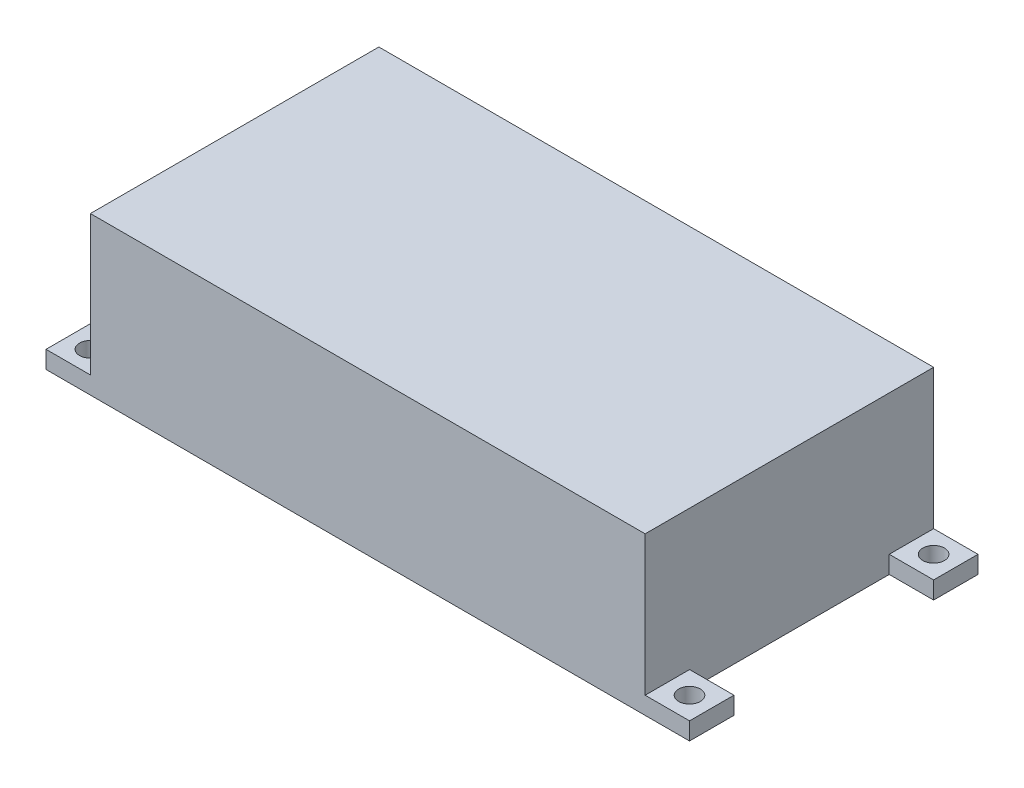
ISO-10303-21;
HEADER;
FILE_DESCRIPTION(('STEP AP214'),'2;1');
FILE_NAME('part.step','',(''),(''),'','','');
FILE_SCHEMA(('AUTOMOTIVE_DESIGN { 1 0 10303 214 1 1 1 1 }'));
ENDSEC;
DATA;
#1=APPLICATION_CONTEXT('core data for automotive mechanical design processes');
#2=APPLICATION_PROTOCOL_DEFINITION('international standard','automotive_design',2000,#1);
#3=PRODUCT_CONTEXT('',#1,'mechanical');
#4=PRODUCT('Part','Part','',(#3));
#5=PRODUCT_RELATED_PRODUCT_CATEGORY('part','',(#4));
#6=PRODUCT_DEFINITION_FORMATION('','',#4);
#7=PRODUCT_DEFINITION_CONTEXT('part definition',#1,'design');
#8=PRODUCT_DEFINITION('design','',#6,#7);
#9=PRODUCT_DEFINITION_SHAPE('','',#8);
#10=(LENGTH_UNIT() NAMED_UNIT(*) SI_UNIT(.MILLI.,.METRE.));
#11=(NAMED_UNIT(*) PLANE_ANGLE_UNIT() SI_UNIT($,.RADIAN.));
#12=(NAMED_UNIT(*) SI_UNIT($,.STERADIAN.) SOLID_ANGLE_UNIT());
#13=UNCERTAINTY_MEASURE_WITH_UNIT(LENGTH_MEASURE(1.E-05),#10,'distance_accuracy_value','');
#14=(GEOMETRIC_REPRESENTATION_CONTEXT(3) GLOBAL_UNCERTAINTY_ASSIGNED_CONTEXT((#13)) GLOBAL_UNIT_ASSIGNED_CONTEXT((#10,
#11,#12)) REPRESENTATION_CONTEXT('',''));
#15=CARTESIAN_POINT('',(0.,0.,0.));
#16=DIRECTION('',(0.,0.,1.));
#17=DIRECTION('',(1.,0.,0.));
#18=AXIS2_PLACEMENT_3D('',#15,#16,#17);
#19=CARTESIAN_POINT('',(6.35000038146973,22.5,41.2749977111816));
#20=DIRECTION('',(1.,0.,0.));
#21=DIRECTION('',(0.,0.,-1.));
#22=AXIS2_PLACEMENT_3D('',#19,#20,#21);
#23=PLANE('',#22);
#24=DIRECTION('',(0.,0.,-1.));
#25=VECTOR('',#24,1.);
#26=CARTESIAN_POINT('',(6.35000038146973,2.5,0.));
#27=LINE('',#26,#25);
#28=CARTESIAN_POINT('',(6.35000038146973,2.5,6.35000038146973));
#29=VERTEX_POINT('',#28);
#30=CARTESIAN_POINT('',(6.35000038146973,2.50000000000001,0.));
#31=VERTEX_POINT('',#30);
#32=EDGE_CURVE('E54',#29,#31,#27,.T.);
#33=ORIENTED_EDGE('',*,*,#32,.F.);
#34=DIRECTION('',(0.,-1.,0.));
#35=VECTOR('',#34,1.);
#36=CARTESIAN_POINT('',(6.35000038146973,2.5,6.35000038146973));
#37=LINE('',#36,#35);
#38=CARTESIAN_POINT('',(6.35000038146973,0.,6.35000038146973));
#39=VERTEX_POINT('',#38);
#40=EDGE_CURVE('E212',#29,#39,#37,.T.);
#41=ORIENTED_EDGE('',*,*,#40,.T.);
#42=DIRECTION('',(0.,0.,1.));
#43=VECTOR('',#42,1.);
#44=CARTESIAN_POINT('',(6.35000038146973,0.,41.2749977111816));
#45=LINE('',#44,#43);
#46=CARTESIAN_POINT('',(6.35000038146973,0.,34.916017758523));
#47=VERTEX_POINT('',#46);
#48=EDGE_CURVE('E371',#39,#47,#45,.T.);
#49=ORIENTED_EDGE('',*,*,#48,.T.);
#50=DIRECTION('',(0.,-1.,0.));
#51=VECTOR('',#50,1.);
#52=CARTESIAN_POINT('',(6.35000038146973,2.5,34.916017758523));
#53=LINE('',#52,#51);
#54=CARTESIAN_POINT('',(6.35000038146973,2.5,34.916017758523));
#55=VERTEX_POINT('',#54);
#56=EDGE_CURVE('E248',#55,#47,#53,.T.);
#57=ORIENTED_EDGE('',*,*,#56,.F.);
#58=DIRECTION('',(0.,0.,-1.));
#59=VECTOR('',#58,1.);
#60=CARTESIAN_POINT('',(6.35000038146973,2.5,41.2749977111816));
#61=LINE('',#60,#59);
#62=CARTESIAN_POINT('',(6.35000038146973,2.50000000000001,41.2749977111816));
#63=VERTEX_POINT('',#62);
#64=EDGE_CURVE('E237',#63,#55,#61,.T.);
#65=ORIENTED_EDGE('',*,*,#64,.F.);
#66=DIRECTION('',(0.,-1.,0.));
#67=VECTOR('',#66,1.);
#68=CARTESIAN_POINT('',(6.35000038146973,22.5,41.2749977111816));
#69=LINE('',#68,#67);
#70=CARTESIAN_POINT('',(6.35000038146973,22.5,41.2749977111816));
#71=VERTEX_POINT('',#70);
#72=EDGE_CURVE('E375',#71,#63,#69,.T.);
#73=ORIENTED_EDGE('',*,*,#72,.F.);
#74=DIRECTION('',(0.,0.,1.));
#75=VECTOR('',#74,1.);
#76=CARTESIAN_POINT('',(6.35000038146973,22.5,41.2749977111816));
#77=LINE('',#76,#75);
#78=CARTESIAN_POINT('',(6.35000038146973,22.5,0.));
#79=VERTEX_POINT('',#78);
#80=EDGE_CURVE('E362',#79,#71,#77,.T.);
#81=ORIENTED_EDGE('',*,*,#80,.F.);
#82=DIRECTION('',(0.,-1.,0.));
#83=VECTOR('',#82,1.);
#84=CARTESIAN_POINT('',(6.35000038146973,22.5,0.));
#85=LINE('',#84,#83);
#86=EDGE_CURVE('E47',#79,#31,#85,.T.);
#87=ORIENTED_EDGE('',*,*,#86,.T.);
#88=EDGE_LOOP('',(#33,#41,#49,#57,#65,#73,#81,#87));
#89=FACE_BOUND('',#88,.T.);
#90=ADVANCED_FACE('F39',(#89),#23,.F.);
#91=CARTESIAN_POINT('',(85.7250061035156,22.5,41.2749977111816));
#92=DIRECTION('',(-1.,0.,0.));
#93=DIRECTION('',(0.,0.,1.));
#94=AXIS2_PLACEMENT_3D('',#91,#92,#93);
#95=PLANE('',#94);
#96=DIRECTION('',(0.,0.,1.));
#97=VECTOR('',#96,1.);
#98=CARTESIAN_POINT('',(85.7250061035156,2.5,41.2749977111816));
#99=LINE('',#98,#97);
#100=CARTESIAN_POINT('',(85.7250061035156,2.5,34.916017758523));
#101=VERTEX_POINT('',#100);
#102=CARTESIAN_POINT('',(85.7250061035156,2.50000000000001,41.2749977111816));
#103=VERTEX_POINT('',#102);
#104=EDGE_CURVE('E261',#101,#103,#99,.T.);
#105=ORIENTED_EDGE('',*,*,#104,.F.);
#106=DIRECTION('',(0.,-1.,0.));
#107=VECTOR('',#106,1.);
#108=CARTESIAN_POINT('',(85.7250061035156,2.5,34.916017758523));
#109=LINE('',#108,#107);
#110=CARTESIAN_POINT('',(85.7250061035156,0.,34.916017758523));
#111=VERTEX_POINT('',#110);
#112=EDGE_CURVE('E272',#101,#111,#109,.T.);
#113=ORIENTED_EDGE('',*,*,#112,.T.);
#114=DIRECTION('',(0.,0.,-1.));
#115=VECTOR('',#114,1.);
#116=CARTESIAN_POINT('',(85.7250061035156,0.,41.2749977111816));
#117=LINE('',#116,#115);
#118=CARTESIAN_POINT('',(85.7250061035156,0.,6.34999942779541));
#119=VERTEX_POINT('',#118);
#120=EDGE_CURVE('E351',#111,#119,#117,.T.);
#121=ORIENTED_EDGE('',*,*,#120,.T.);
#122=DIRECTION('',(0.,-1.,0.));
#123=VECTOR('',#122,1.);
#124=CARTESIAN_POINT('',(85.7250061035156,2.5,6.34999942779541));
#125=LINE('',#124,#123);
#126=CARTESIAN_POINT('',(85.7250061035156,2.5,6.34999942779541));
#127=VERTEX_POINT('',#126);
#128=EDGE_CURVE('E311',#127,#119,#125,.T.);
#129=ORIENTED_EDGE('',*,*,#128,.F.);
#130=DIRECTION('',(0.,0.,1.));
#131=VECTOR('',#130,1.);
#132=CARTESIAN_POINT('',(85.7250061035156,2.5,0.));
#133=LINE('',#132,#131);
#134=CARTESIAN_POINT('',(85.7250061035156,2.50000000000001,0.));
#135=VERTEX_POINT('',#134);
#136=EDGE_CURVE('E291',#135,#127,#133,.T.);
#137=ORIENTED_EDGE('',*,*,#136,.F.);
#138=DIRECTION('',(0.,-1.,0.));
#139=VECTOR('',#138,1.);
#140=CARTESIAN_POINT('',(85.7250061035156,22.5,0.));
#141=LINE('',#140,#139);
#142=CARTESIAN_POINT('',(85.7250061035156,22.5,0.));
#143=VERTEX_POINT('',#142);
#144=EDGE_CURVE('E11',#143,#135,#141,.T.);
#145=ORIENTED_EDGE('',*,*,#144,.F.);
#146=DIRECTION('',(0.,0.,-1.));
#147=VECTOR('',#146,1.);
#148=CARTESIAN_POINT('',(85.7250061035156,22.5,41.2749977111816));
#149=LINE('',#148,#147);
#150=CARTESIAN_POINT('',(85.7250061035156,22.5,41.2749977111816));
#151=VERTEX_POINT('',#150);
#152=EDGE_CURVE('E356',#151,#143,#149,.T.);
#153=ORIENTED_EDGE('',*,*,#152,.F.);
#154=DIRECTION('',(0.,-1.,0.));
#155=VECTOR('',#154,1.);
#156=CARTESIAN_POINT('',(85.7250061035156,22.5,41.2749977111816));
#157=LINE('',#156,#155);
#158=EDGE_CURVE('E366',#151,#103,#157,.T.);
#159=ORIENTED_EDGE('',*,*,#158,.T.);
#160=EDGE_LOOP('',(#105,#113,#121,#129,#137,#145,#153,#159));
#161=FACE_BOUND('',#160,.T.);
#162=ADVANCED_FACE('F41',(#161),#95,.F.);
#163=CARTESIAN_POINT('',(85.7250061035156,22.5,0.));
#164=DIRECTION('',(0.,0.,1.));
#165=DIRECTION('',(1.,0.,0.));
#166=AXIS2_PLACEMENT_3D('',#163,#164,#165);
#167=PLANE('',#166);
#168=DIRECTION('',(1.,0.,0.));
#169=VECTOR('',#168,1.);
#170=CARTESIAN_POINT('',(7.93750047683716,21.,0.));
#171=LINE('',#170,#169);
#172=CARTESIAN_POINT('',(7.93750047683716,21.,0.));
#173=VERTEX_POINT('',#172);
#174=CARTESIAN_POINT('',(15.2375004768372,21.,0.));
#175=VERTEX_POINT('',#174);
#176=EDGE_CURVE('E315',#173,#175,#171,.T.);
#177=ORIENTED_EDGE('',*,*,#176,.F.);
#178=DIRECTION('',(0.,-1.,0.));
#179=VECTOR('',#178,1.);
#180=CARTESIAN_POINT('',(7.93750047683716,21.,0.));
#181=LINE('',#180,#179);
#182=CARTESIAN_POINT('',(7.93750047683716,0.,0.));
#183=VERTEX_POINT('',#182);
#184=EDGE_CURVE('E320',#173,#183,#181,.T.);
#185=ORIENTED_EDGE('',*,*,#184,.T.);
#186=DIRECTION('',(-1.,0.,0.));
#187=VECTOR('',#186,1.);
#188=CARTESIAN_POINT('',(85.7250061035156,0.,0.));
#189=LINE('',#188,#187);
#190=CARTESIAN_POINT('',(0.,0.,0.));
#191=VERTEX_POINT('',#190);
#192=EDGE_CURVE('E201',#183,#191,#189,.T.);
#193=ORIENTED_EDGE('',*,*,#192,.T.);
#194=DIRECTION('',(0.,-1.,0.));
#195=VECTOR('',#194,1.);
#196=CARTESIAN_POINT('',(0.,2.5,0.));
#197=LINE('',#196,#195);
#198=CARTESIAN_POINT('',(0.,2.5,0.));
#199=VERTEX_POINT('',#198);
#200=EDGE_CURVE('E196',#199,#191,#197,.T.);
#201=ORIENTED_EDGE('',*,*,#200,.F.);
#202=DIRECTION('',(-1.,0.,0.));
#203=VECTOR('',#202,1.);
#204=CARTESIAN_POINT('',(6.35000038146973,2.5,0.));
#205=LINE('',#204,#203);
#206=EDGE_CURVE('E186',#31,#199,#205,.T.);
#207=ORIENTED_EDGE('',*,*,#206,.F.);
#208=ORIENTED_EDGE('',*,*,#86,.F.);
#209=DIRECTION('',(-1.,0.,0.));
#210=VECTOR('',#209,1.);
#211=CARTESIAN_POINT('',(85.7250061035156,22.5,0.));
#212=LINE('',#211,#210);
#213=EDGE_CURVE('E359',#143,#79,#212,.T.);
#214=ORIENTED_EDGE('',*,*,#213,.F.);
#215=ORIENTED_EDGE('',*,*,#144,.T.);
#216=DIRECTION('',(-1.,0.,0.));
#217=VECTOR('',#216,1.);
#218=CARTESIAN_POINT('',(85.7250061035156,2.5,0.));
#219=LINE('',#218,#217);
#220=CARTESIAN_POINT('',(92.075005531311,2.5,0.));
#221=VERTEX_POINT('',#220);
#222=EDGE_CURVE('E299',#221,#135,#219,.T.);
#223=ORIENTED_EDGE('',*,*,#222,.F.);
#224=DIRECTION('',(0.,-1.,0.));
#225=VECTOR('',#224,1.);
#226=CARTESIAN_POINT('',(92.075005531311,2.5,0.));
#227=LINE('',#226,#225);
#228=CARTESIAN_POINT('',(92.075005531311,0.,0.));
#229=VERTEX_POINT('',#228);
#230=EDGE_CURVE('E302',#221,#229,#227,.T.);
#231=ORIENTED_EDGE('',*,*,#230,.T.);
#232=CARTESIAN_POINT('',(15.2375004768372,0.,0.));
#233=VERTEX_POINT('',#232);
#234=EDGE_CURVE('E368',#229,#233,#189,.T.);
#235=ORIENTED_EDGE('',*,*,#234,.T.);
#236=DIRECTION('',(0.,-1.,0.));
#237=VECTOR('',#236,1.);
#238=CARTESIAN_POINT('',(15.2375004768372,21.,0.));
#239=LINE('',#238,#237);
#240=EDGE_CURVE('E326',#175,#233,#239,.T.);
#241=ORIENTED_EDGE('',*,*,#240,.F.);
#242=EDGE_LOOP('',(#177,#185,#193,#201,#207,#208,#214,#215,#223,#231,#235,#241));
#243=FACE_BOUND('',#242,.T.);
#244=ADVANCED_FACE('F198',(#243),#167,.F.);
#245=CARTESIAN_POINT('',(85.7250061035156,22.5,41.2749977111816));
#246=DIRECTION('',(0.,0.,-1.));
#247=DIRECTION('',(-1.,0.,0.));
#248=AXIS2_PLACEMENT_3D('',#245,#246,#247);
#249=PLANE('',#248);
#250=DIRECTION('',(1.,0.,0.));
#251=VECTOR('',#250,1.);
#252=CARTESIAN_POINT('',(85.7250061035156,0.,41.2749977111816));
#253=LINE('',#252,#251);
#254=CARTESIAN_POINT('',(0.,0.,41.2749977111816));
#255=VERTEX_POINT('',#254);
#256=CARTESIAN_POINT('',(92.0750012397766,0.,41.2749977111816));
#257=VERTEX_POINT('',#256);
#258=EDGE_CURVE('E360',#255,#257,#253,.T.);
#259=ORIENTED_EDGE('',*,*,#258,.T.);
#260=DIRECTION('',(0.,-1.,0.));
#261=VECTOR('',#260,1.);
#262=CARTESIAN_POINT('',(92.0750012397766,2.5,41.2749977111816));
#263=LINE('',#262,#261);
#264=CARTESIAN_POINT('',(92.0750012397766,2.5,41.2749977111816));
#265=VERTEX_POINT('',#264);
#266=EDGE_CURVE('E281',#265,#257,#263,.T.);
#267=ORIENTED_EDGE('',*,*,#266,.F.);
#268=DIRECTION('',(1.,0.,0.));
#269=VECTOR('',#268,1.);
#270=CARTESIAN_POINT('',(85.7250061035156,2.5,41.2749977111816));
#271=LINE('',#270,#269);
#272=EDGE_CURVE('E264',#103,#265,#271,.T.);
#273=ORIENTED_EDGE('',*,*,#272,.F.);
#274=ORIENTED_EDGE('',*,*,#158,.F.);
#275=DIRECTION('',(1.,0.,0.));
#276=VECTOR('',#275,1.);
#277=CARTESIAN_POINT('',(85.7250061035156,22.5,41.2749977111816));
#278=LINE('',#277,#276);
#279=EDGE_CURVE('E364',#71,#151,#278,.T.);
#280=ORIENTED_EDGE('',*,*,#279,.F.);
#281=ORIENTED_EDGE('',*,*,#72,.T.);
#282=DIRECTION('',(1.,0.,0.));
#283=VECTOR('',#282,1.);
#284=CARTESIAN_POINT('',(0.,2.5,41.2749977111816));
#285=LINE('',#284,#283);
#286=CARTESIAN_POINT('',(0.,2.5,41.2749977111816));
#287=VERTEX_POINT('',#286);
#288=EDGE_CURVE('E233',#287,#63,#285,.T.);
#289=ORIENTED_EDGE('',*,*,#288,.F.);
#290=DIRECTION('',(0.,-1.,0.));
#291=VECTOR('',#290,1.);
#292=CARTESIAN_POINT('',(0.,2.5,41.2749977111816));
#293=LINE('',#292,#291);
#294=EDGE_CURVE('E251',#287,#255,#293,.T.);
#295=ORIENTED_EDGE('',*,*,#294,.T.);
#296=EDGE_LOOP('',(#259,#267,#273,#274,#280,#281,#289,#295));
#297=FACE_BOUND('',#296,.T.);
#298=ADVANCED_FACE('F380',(#297),#249,.F.);
#299=CARTESIAN_POINT('',(0.,22.5,0.));
#300=DIRECTION('',(0.,1.,0.));
#301=DIRECTION('',(0.,0.,1.));
#302=AXIS2_PLACEMENT_3D('',#299,#300,#301);
#303=PLANE('',#302);
#304=ORIENTED_EDGE('',*,*,#152,.T.);
#305=ORIENTED_EDGE('',*,*,#213,.T.);
#306=ORIENTED_EDGE('',*,*,#80,.T.);
#307=ORIENTED_EDGE('',*,*,#279,.T.);
#308=EDGE_LOOP('',(#304,#305,#306,#307));
#309=FACE_BOUND('',#308,.T.);
#310=ADVANCED_FACE('F415',(#309),#303,.T.);
#311=CARTESIAN_POINT('',(0.,0.,0.));
#312=DIRECTION('',(0.,1.,0.));
#313=DIRECTION('',(0.,0.,1.));
#314=AXIS2_PLACEMENT_3D('',#311,#312,#313);
#315=PLANE('',#314);
#316=ORIENTED_EDGE('',*,*,#192,.F.);
#317=DIRECTION('',(0.,0.,-1.));
#318=VECTOR('',#317,1.);
#319=CARTESIAN_POINT('',(7.93750047683716,0.,1.58749890327454));
#320=LINE('',#319,#318);
#321=CARTESIAN_POINT('',(7.93750047683716,0.,39.6875));
#322=VERTEX_POINT('',#321);
#323=EDGE_CURVE('E345',#322,#183,#320,.T.);
#324=ORIENTED_EDGE('',*,*,#323,.F.);
#325=DIRECTION('',(-1.,0.,0.));
#326=VECTOR('',#325,1.);
#327=CARTESIAN_POINT('',(84.1375045776367,0.,39.6875));
#328=LINE('',#327,#326);
#329=CARTESIAN_POINT('',(84.1375045776367,0.,39.6875));
#330=VERTEX_POINT('',#329);
#331=EDGE_CURVE('E342',#330,#322,#328,.T.);
#332=ORIENTED_EDGE('',*,*,#331,.F.);
#333=DIRECTION('',(0.,0.,1.));
#334=VECTOR('',#333,1.);
#335=CARTESIAN_POINT('',(84.1375045776367,0.,1.58749890327454));
#336=LINE('',#335,#334);
#337=CARTESIAN_POINT('',(84.1375045776367,0.,1.58749890327454));
#338=VERTEX_POINT('',#337);
#339=EDGE_CURVE('E325',#338,#330,#336,.T.);
#340=ORIENTED_EDGE('',*,*,#339,.F.);
#341=DIRECTION('',(1.,0.,0.));
#342=VECTOR('',#341,1.);
#343=CARTESIAN_POINT('',(84.1375045776367,0.,1.58749890327454));
#344=LINE('',#343,#342);
#345=CARTESIAN_POINT('',(15.2375004768372,0.,1.58749890327454));
#346=VERTEX_POINT('',#345);
#347=EDGE_CURVE('E333',#346,#338,#344,.T.);
#348=ORIENTED_EDGE('',*,*,#347,.F.);
#349=DIRECTION('',(0.,0.,1.));
#350=VECTOR('',#349,1.);
#351=CARTESIAN_POINT('',(15.2375004768372,0.,1.58749890327454));
#352=LINE('',#351,#350);
#353=EDGE_CURVE('E314',#233,#346,#352,.T.);
#354=ORIENTED_EDGE('',*,*,#353,.F.);
#355=ORIENTED_EDGE('',*,*,#234,.F.);
#356=DIRECTION('',(1.35166450807797E-06,0.,-0.999999999999087));
#357=VECTOR('',#356,1.);
#358=CARTESIAN_POINT('',(92.075005531311,0.,0.));
#359=LINE('',#358,#357);
#360=CARTESIAN_POINT('',(92.0749969482422,0.,6.34999942779541));
#361=VERTEX_POINT('',#360);
#362=EDGE_CURVE('E295',#361,#229,#359,.T.);
#363=ORIENTED_EDGE('',*,*,#362,.F.);
#364=DIRECTION('',(1.,0.,0.));
#365=VECTOR('',#364,1.);
#366=CARTESIAN_POINT('',(85.7250061035156,0.,6.34999942779541));
#367=LINE('',#366,#365);
#368=EDGE_CURVE('E288',#119,#361,#367,.T.);
#369=ORIENTED_EDGE('',*,*,#368,.F.);
#370=ORIENTED_EDGE('',*,*,#120,.F.);
#371=DIRECTION('',(-1.,0.,0.));
#372=VECTOR('',#371,1.);
#373=CARTESIAN_POINT('',(85.7250061035156,0.,34.916017758523));
#374=LINE('',#373,#372);
#375=CARTESIAN_POINT('',(92.0750012397766,0.,34.916017758523));
#376=VERTEX_POINT('',#375);
#377=EDGE_CURVE('E265',#376,#111,#374,.T.);
#378=ORIENTED_EDGE('',*,*,#377,.F.);
#379=DIRECTION('',(0.,0.,-1.));
#380=VECTOR('',#379,1.);
#381=CARTESIAN_POINT('',(92.0750012397766,0.,41.2749977111816));
#382=LINE('',#381,#380);
#383=EDGE_CURVE('E258',#257,#376,#382,.T.);
#384=ORIENTED_EDGE('',*,*,#383,.F.);
#385=ORIENTED_EDGE('',*,*,#258,.F.);
#386=DIRECTION('',(0.,0.,1.));
#387=VECTOR('',#386,1.);
#388=CARTESIAN_POINT('',(0.,0.,41.2749977111816));
#389=LINE('',#388,#387);
#390=CARTESIAN_POINT('',(0.,0.,34.916017758523));
#391=VERTEX_POINT('',#390);
#392=EDGE_CURVE('E227',#391,#255,#389,.T.);
#393=ORIENTED_EDGE('',*,*,#392,.F.);
#394=DIRECTION('',(-1.,0.,0.));
#395=VECTOR('',#394,1.);
#396=CARTESIAN_POINT('',(0.,0.,34.916017758523));
#397=LINE('',#396,#395);
#398=EDGE_CURVE('E234',#47,#391,#397,.T.);
#399=ORIENTED_EDGE('',*,*,#398,.F.);
#400=ORIENTED_EDGE('',*,*,#48,.F.);
#401=DIRECTION('',(1.,0.,0.));
#402=VECTOR('',#401,1.);
#403=CARTESIAN_POINT('',(6.35000038146973,0.,6.35000038146973));
#404=LINE('',#403,#402);
#405=CARTESIAN_POINT('',(0.,0.,6.35000038146973));
#406=VERTEX_POINT('',#405);
#407=EDGE_CURVE('E218',#406,#39,#404,.T.);
#408=ORIENTED_EDGE('',*,*,#407,.F.);
#409=DIRECTION('',(0.,0.,1.));
#410=VECTOR('',#409,1.);
#411=CARTESIAN_POINT('',(0.,0.,0.));
#412=LINE('',#411,#410);
#413=EDGE_CURVE('E216',#191,#406,#412,.T.);
#414=ORIENTED_EDGE('',*,*,#413,.F.);
#415=EDGE_LOOP('',(#316,#324,#332,#340,#348,#354,#355,#363,#369,#370,#378,#384,#385,#393,#399,
#400,#408,#414));
#416=FACE_BOUND('',#415,.T.);
#417=CARTESIAN_POINT('',(88.9000008486827,0.,3.17499894284246));
#418=DIRECTION('',(0.,1.,0.));
#419=DIRECTION('',(0.,0.,1.));
#420=AXIS2_PLACEMENT_3D('',#417,#418,#419);
#421=CIRCLE('',#420,1.55000024137137);
#422=CARTESIAN_POINT('',(88.9000008486827,0.,4.72499918421383));
#423=VERTEX_POINT('',#422);
#424=EDGE_CURVE('E284',#423,#423,#421,.T.);
#425=ORIENTED_EDGE('',*,*,#424,.T.);
#426=EDGE_LOOP('',(#425));
#427=FACE_BOUND('',#426,.T.);
#428=CARTESIAN_POINT('',(88.9000008005436,0.,38.0999994402673));
#429=DIRECTION('',(0.,1.,0.));
#430=DIRECTION('',(0.,0.,1.));
#431=AXIS2_PLACEMENT_3D('',#428,#429,#430);
#432=CIRCLE('',#431,1.55000020320691);
#433=CARTESIAN_POINT('',(88.9000008005436,0.,39.6499996434742));
#434=VERTEX_POINT('',#433);
#435=EDGE_CURVE('E254',#434,#434,#432,.T.);
#436=ORIENTED_EDGE('',*,*,#435,.T.);
#437=EDGE_LOOP('',(#436));
#438=FACE_BOUND('',#437,.T.);
#439=CARTESIAN_POINT('',(3.17499987352622,0.,38.0999989908047));
#440=DIRECTION('',(0.,1.,0.));
#441=DIRECTION('',(0.,0.,1.));
#442=AXIS2_PLACEMENT_3D('',#439,#440,#441);
#443=CIRCLE('',#442,1.54999975374415);
#444=CARTESIAN_POINT('',(3.17499987352622,0.,39.6499987445488));
#445=VERTEX_POINT('',#444);
#446=EDGE_CURVE('E204',#445,#445,#443,.T.);
#447=ORIENTED_EDGE('',*,*,#446,.T.);
#448=EDGE_LOOP('',(#447));
#449=FACE_BOUND('',#448,.T.);
#450=CARTESIAN_POINT('',(3.1749998874721,0.,3.17499986372949));
#451=DIRECTION('',(0.,1.,0.));
#452=DIRECTION('',(0.,0.,1.));
#453=AXIS2_PLACEMENT_3D('',#450,#451,#452);
#454=CIRCLE('',#453,1.54999978657689);
#455=CARTESIAN_POINT('',(3.1749998874721,0.,4.72499965030638));
#456=VERTEX_POINT('',#455);
#457=EDGE_CURVE('E515',#456,#456,#454,.T.);
#458=ORIENTED_EDGE('',*,*,#457,.T.);
#459=EDGE_LOOP('',(#458));
#460=FACE_BOUND('',#459,.T.);
#461=ADVANCED_FACE('F401',(#416,#427,#438,#449,#460),#315,.F.);
#462=CARTESIAN_POINT('',(84.1375045776367,21.,1.58749890327454));
#463=DIRECTION('',(1.,0.,0.));
#464=DIRECTION('',(0.,0.,-1.));
#465=AXIS2_PLACEMENT_3D('',#462,#463,#464);
#466=PLANE('',#465);
#467=ORIENTED_EDGE('',*,*,#339,.T.);
#468=DIRECTION('',(0.,-1.,0.));
#469=VECTOR('',#468,1.);
#470=CARTESIAN_POINT('',(84.1375045776367,21.,39.6875));
#471=LINE('',#470,#469);
#472=CARTESIAN_POINT('',(84.1375045776367,21.,39.6875));
#473=VERTEX_POINT('',#472);
#474=EDGE_CURVE('E340',#473,#330,#471,.T.);
#475=ORIENTED_EDGE('',*,*,#474,.F.);
#476=DIRECTION('',(0.,0.,1.));
#477=VECTOR('',#476,1.);
#478=CARTESIAN_POINT('',(84.1375045776367,21.,1.58749890327454));
#479=LINE('',#478,#477);
#480=CARTESIAN_POINT('',(84.1375045776367,21.,1.58749890327454));
#481=VERTEX_POINT('',#480);
#482=EDGE_CURVE('E329',#481,#473,#479,.T.);
#483=ORIENTED_EDGE('',*,*,#482,.F.);
#484=DIRECTION('',(0.,-1.,0.));
#485=VECTOR('',#484,1.);
#486=CARTESIAN_POINT('',(84.1375045776367,21.,1.58749890327454));
#487=LINE('',#486,#485);
#488=EDGE_CURVE('E348',#481,#338,#487,.T.);
#489=ORIENTED_EDGE('',*,*,#488,.T.);
#490=EDGE_LOOP('',(#467,#475,#483,#489));
#491=FACE_BOUND('',#490,.T.);
#492=ADVANCED_FACE('F434',(#491),#466,.F.);
#493=CARTESIAN_POINT('',(84.1375045776367,21.,1.58749890327454));
#494=DIRECTION('',(0.,0.,-1.));
#495=DIRECTION('',(-1.,0.,0.));
#496=AXIS2_PLACEMENT_3D('',#493,#494,#495);
#497=PLANE('',#496);
#498=DIRECTION('',(1.,0.,0.));
#499=VECTOR('',#498,1.);
#500=CARTESIAN_POINT('',(84.1375045776367,21.,1.58749890327454));
#501=LINE('',#500,#499);
#502=CARTESIAN_POINT('',(15.2375004768372,21.,1.58749890327454));
#503=VERTEX_POINT('',#502);
#504=EDGE_CURVE('E338',#503,#481,#501,.T.);
#505=ORIENTED_EDGE('',*,*,#504,.F.);
#506=DIRECTION('',(0.,-1.,0.));
#507=VECTOR('',#506,1.);
#508=CARTESIAN_POINT('',(15.2375004768372,21.,1.58749890327454));
#509=LINE('',#508,#507);
#510=EDGE_CURVE('E322',#503,#346,#509,.T.);
#511=ORIENTED_EDGE('',*,*,#510,.T.);
#512=ORIENTED_EDGE('',*,*,#347,.T.);
#513=ORIENTED_EDGE('',*,*,#488,.F.);
#514=EDGE_LOOP('',(#505,#511,#512,#513));
#515=FACE_BOUND('',#514,.T.);
#516=ADVANCED_FACE('F438',(#515),#497,.F.);
#517=CARTESIAN_POINT('',(7.93750047683716,21.,1.58749890327454));
#518=DIRECTION('',(-1.,0.,0.));
#519=DIRECTION('',(0.,0.,1.));
#520=AXIS2_PLACEMENT_3D('',#517,#518,#519);
#521=PLANE('',#520);
#522=ORIENTED_EDGE('',*,*,#323,.T.);
#523=ORIENTED_EDGE('',*,*,#184,.F.);
#524=DIRECTION('',(0.,0.,-1.));
#525=VECTOR('',#524,1.);
#526=CARTESIAN_POINT('',(7.93750047683716,21.,1.58749890327454));
#527=LINE('',#526,#525);
#528=CARTESIAN_POINT('',(7.93750047683716,21.,39.6875));
#529=VERTEX_POINT('',#528);
#530=EDGE_CURVE('E336',#529,#173,#527,.T.);
#531=ORIENTED_EDGE('',*,*,#530,.F.);
#532=DIRECTION('',(0.,-1.,0.));
#533=VECTOR('',#532,1.);
#534=CARTESIAN_POINT('',(7.93750047683716,21.,39.6875));
#535=LINE('',#534,#533);
#536=EDGE_CURVE('E352',#529,#322,#535,.T.);
#537=ORIENTED_EDGE('',*,*,#536,.T.);
#538=EDGE_LOOP('',(#522,#523,#531,#537));
#539=FACE_BOUND('',#538,.T.);
#540=ADVANCED_FACE('F444',(#539),#521,.F.);
#541=CARTESIAN_POINT('',(84.1375045776367,21.,39.6875));
#542=DIRECTION('',(0.,0.,1.));
#543=DIRECTION('',(1.,0.,0.));
#544=AXIS2_PLACEMENT_3D('',#541,#542,#543);
#545=PLANE('',#544);
#546=ORIENTED_EDGE('',*,*,#331,.T.);
#547=ORIENTED_EDGE('',*,*,#536,.F.);
#548=DIRECTION('',(-1.,0.,0.));
#549=VECTOR('',#548,1.);
#550=CARTESIAN_POINT('',(84.1375045776367,21.,39.6875));
#551=LINE('',#550,#549);
#552=EDGE_CURVE('E332',#473,#529,#551,.T.);
#553=ORIENTED_EDGE('',*,*,#552,.F.);
#554=ORIENTED_EDGE('',*,*,#474,.T.);
#555=EDGE_LOOP('',(#546,#547,#553,#554));
#556=FACE_BOUND('',#555,.T.);
#557=ADVANCED_FACE('F440',(#556),#545,.F.);
#558=CARTESIAN_POINT('',(0.,21.,0.));
#559=DIRECTION('',(0.,-1.,0.));
#560=DIRECTION('',(0.,0.,-1.));
#561=AXIS2_PLACEMENT_3D('',#558,#559,#560);
#562=PLANE('',#561);
#563=ORIENTED_EDGE('',*,*,#482,.T.);
#564=ORIENTED_EDGE('',*,*,#552,.T.);
#565=ORIENTED_EDGE('',*,*,#530,.T.);
#566=ORIENTED_EDGE('',*,*,#176,.T.);
#567=DIRECTION('',(0.,0.,1.));
#568=VECTOR('',#567,1.);
#569=CARTESIAN_POINT('',(15.2375004768372,21.,1.58749890327454));
#570=LINE('',#569,#568);
#571=EDGE_CURVE('E318',#175,#503,#570,.T.);
#572=ORIENTED_EDGE('',*,*,#571,.T.);
#573=ORIENTED_EDGE('',*,*,#504,.T.);
#574=EDGE_LOOP('',(#563,#564,#565,#566,#572,#573));
#575=FACE_BOUND('',#574,.T.);
#576=ADVANCED_FACE('F443',(#575),#562,.T.);
#577=CARTESIAN_POINT('',(15.2375004768372,21.,1.58749890327454));
#578=DIRECTION('',(1.,0.,0.));
#579=DIRECTION('',(0.,0.,-1.));
#580=AXIS2_PLACEMENT_3D('',#577,#578,#579);
#581=PLANE('',#580);
#582=ORIENTED_EDGE('',*,*,#353,.T.);
#583=ORIENTED_EDGE('',*,*,#510,.F.);
#584=ORIENTED_EDGE('',*,*,#571,.F.);
#585=ORIENTED_EDGE('',*,*,#240,.T.);
#586=EDGE_LOOP('',(#582,#583,#584,#585));
#587=FACE_BOUND('',#586,.T.);
#588=ADVANCED_FACE('F454',(#587),#581,.F.);
#589=CARTESIAN_POINT('',(0.,2.5,0.));
#590=DIRECTION('',(0.,1.,0.));
#591=DIRECTION('',(0.,0.,1.));
#592=AXIS2_PLACEMENT_3D('',#589,#590,#591);
#593=PLANE('',#592);
#594=ORIENTED_EDGE('',*,*,#136,.T.);
#595=DIRECTION('',(1.,0.,0.));
#596=VECTOR('',#595,1.);
#597=CARTESIAN_POINT('',(85.7250061035156,2.5,6.34999942779541));
#598=LINE('',#597,#596);
#599=CARTESIAN_POINT('',(92.0749969482422,2.5,6.34999942779541));
#600=VERTEX_POINT('',#599);
#601=EDGE_CURVE('E294',#127,#600,#598,.T.);
#602=ORIENTED_EDGE('',*,*,#601,.T.);
#603=DIRECTION('',(1.35166450807797E-06,0.,-0.999999999999087));
#604=VECTOR('',#603,1.);
#605=CARTESIAN_POINT('',(92.075005531311,2.5,0.));
#606=LINE('',#605,#604);
#607=EDGE_CURVE('E297',#600,#221,#606,.T.);
#608=ORIENTED_EDGE('',*,*,#607,.T.);
#609=ORIENTED_EDGE('',*,*,#222,.T.);
#610=EDGE_LOOP('',(#594,#602,#608,#609));
#611=FACE_BOUND('',#610,.T.);
#612=CARTESIAN_POINT('',(88.9000008486827,2.5,3.17499894284246));
#613=DIRECTION('',(0.,1.,0.));
#614=DIRECTION('',(0.,0.,1.));
#615=AXIS2_PLACEMENT_3D('',#612,#613,#614);
#616=CIRCLE('',#615,1.55000024137137);
#617=CARTESIAN_POINT('',(88.9000008486827,2.5,4.72499918421383));
#618=VERTEX_POINT('',#617);
#619=EDGE_CURVE('E285',#618,#618,#616,.T.);
#620=ORIENTED_EDGE('',*,*,#619,.F.);
#621=EDGE_LOOP('',(#620));
#622=FACE_BOUND('',#621,.T.);
#623=ADVANCED_FACE('F458',(#611,#622),#593,.T.);
#624=CARTESIAN_POINT('',(85.7250061035156,2.5,6.34999942779541));
#625=DIRECTION('',(0.,0.,-1.));
#626=DIRECTION('',(-1.,0.,0.));
#627=AXIS2_PLACEMENT_3D('',#624,#625,#626);
#628=PLANE('',#627);
#629=ORIENTED_EDGE('',*,*,#368,.T.);
#630=DIRECTION('',(0.,-1.,0.));
#631=VECTOR('',#630,1.);
#632=CARTESIAN_POINT('',(92.0749969482422,2.5,6.34999942779541));
#633=LINE('',#632,#631);
#634=EDGE_CURVE('E308',#600,#361,#633,.T.);
#635=ORIENTED_EDGE('',*,*,#634,.F.);
#636=ORIENTED_EDGE('',*,*,#601,.F.);
#637=ORIENTED_EDGE('',*,*,#128,.T.);
#638=EDGE_LOOP('',(#629,#635,#636,#637));
#639=FACE_BOUND('',#638,.T.);
#640=ADVANCED_FACE('F460',(#639),#628,.F.);
#641=CARTESIAN_POINT('',(92.075005531311,2.5,0.));
#642=DIRECTION('',(-0.999999999999087,0.,-1.35166450807797E-06));
#643=DIRECTION('',(-1.35166450807797E-06,0.,0.999999999999087));
#644=AXIS2_PLACEMENT_3D('',#641,#642,#643);
#645=PLANE('',#644);
#646=ORIENTED_EDGE('',*,*,#362,.T.);
#647=ORIENTED_EDGE('',*,*,#230,.F.);
#648=ORIENTED_EDGE('',*,*,#607,.F.);
#649=ORIENTED_EDGE('',*,*,#634,.T.);
#650=EDGE_LOOP('',(#646,#647,#648,#649));
#651=FACE_BOUND('',#650,.T.);
#652=ADVANCED_FACE('F463',(#651),#645,.F.);
#653=CARTESIAN_POINT('',(88.9000008486827,2.5,3.17499894284246));
#654=DIRECTION('',(0.,-1.,0.));
#655=DIRECTION('',(0.,0.,-1.));
#656=AXIS2_PLACEMENT_3D('',#653,#654,#655);
#657=CYLINDRICAL_SURFACE('',#656,1.55000024137137);
#658=ORIENTED_EDGE('',*,*,#619,.T.);
#659=EDGE_LOOP('',(#658));
#660=FACE_BOUND('',#659,.T.);
#661=ORIENTED_EDGE('',*,*,#424,.F.);
#662=EDGE_LOOP('',(#661));
#663=FACE_BOUND('',#662,.T.);
#664=ADVANCED_FACE('F467',(#660,#663),#657,.F.);
#665=CARTESIAN_POINT('',(0.,2.5,0.));
#666=DIRECTION('',(0.,-1.,0.));
#667=DIRECTION('',(0.,0.,-1.));
#668=AXIS2_PLACEMENT_3D('',#665,#666,#667);
#669=PLANE('',#668);
#670=ORIENTED_EDGE('',*,*,#104,.T.);
#671=ORIENTED_EDGE('',*,*,#272,.T.);
#672=DIRECTION('',(0.,0.,-1.));
#673=VECTOR('',#672,1.);
#674=CARTESIAN_POINT('',(92.0750012397766,2.5,41.2749977111816));
#675=LINE('',#674,#673);
#676=CARTESIAN_POINT('',(92.0750012397766,2.5,34.916017758523));
#677=VERTEX_POINT('',#676);
#678=EDGE_CURVE('E267',#265,#677,#675,.T.);
#679=ORIENTED_EDGE('',*,*,#678,.T.);
#680=DIRECTION('',(-1.,0.,0.));
#681=VECTOR('',#680,1.);
#682=CARTESIAN_POINT('',(85.7250061035156,2.5,34.916017758523));
#683=LINE('',#682,#681);
#684=EDGE_CURVE('E269',#677,#101,#683,.T.);
#685=ORIENTED_EDGE('',*,*,#684,.T.);
#686=EDGE_LOOP('',(#670,#671,#679,#685));
#687=FACE_BOUND('',#686,.T.);
#688=CARTESIAN_POINT('',(88.9000008005436,2.5,38.0999994402673));
#689=DIRECTION('',(0.,1.,0.));
#690=DIRECTION('',(0.,0.,1.));
#691=AXIS2_PLACEMENT_3D('',#688,#689,#690);
#692=CIRCLE('',#691,1.55000020320691);
#693=CARTESIAN_POINT('',(88.9000008005436,2.5,39.6499996434742));
#694=VERTEX_POINT('',#693);
#695=EDGE_CURVE('E255',#694,#694,#692,.T.);
#696=ORIENTED_EDGE('',*,*,#695,.F.);
#697=EDGE_LOOP('',(#696));
#698=FACE_BOUND('',#697,.T.);
#699=ADVANCED_FACE('F409',(#687,#698),#669,.F.);
#700=CARTESIAN_POINT('',(92.0750012397766,2.5,41.2749977111816));
#701=DIRECTION('',(-1.,0.,0.));
#702=DIRECTION('',(0.,0.,1.));
#703=AXIS2_PLACEMENT_3D('',#700,#701,#702);
#704=PLANE('',#703);
#705=ORIENTED_EDGE('',*,*,#383,.T.);
#706=DIRECTION('',(0.,-1.,0.));
#707=VECTOR('',#706,1.);
#708=CARTESIAN_POINT('',(92.0750012397766,2.5,34.916017758523));
#709=LINE('',#708,#707);
#710=EDGE_CURVE('E278',#677,#376,#709,.T.);
#711=ORIENTED_EDGE('',*,*,#710,.F.);
#712=ORIENTED_EDGE('',*,*,#678,.F.);
#713=ORIENTED_EDGE('',*,*,#266,.T.);
#714=EDGE_LOOP('',(#705,#711,#712,#713));
#715=FACE_BOUND('',#714,.T.);
#716=ADVANCED_FACE('F398',(#715),#704,.F.);
#717=CARTESIAN_POINT('',(85.7250061035156,2.5,34.916017758523));
#718=DIRECTION('',(0.,0.,1.));
#719=DIRECTION('',(1.,0.,0.));
#720=AXIS2_PLACEMENT_3D('',#717,#718,#719);
#721=PLANE('',#720);
#722=ORIENTED_EDGE('',*,*,#377,.T.);
#723=ORIENTED_EDGE('',*,*,#112,.F.);
#724=ORIENTED_EDGE('',*,*,#684,.F.);
#725=ORIENTED_EDGE('',*,*,#710,.T.);
#726=EDGE_LOOP('',(#722,#723,#724,#725));
#727=FACE_BOUND('',#726,.T.);
#728=ADVANCED_FACE('F406',(#727),#721,.F.);
#729=CARTESIAN_POINT('',(88.9000008005436,2.5,38.0999994402673));
#730=DIRECTION('',(0.,-1.,0.));
#731=DIRECTION('',(0.,0.,-1.));
#732=AXIS2_PLACEMENT_3D('',#729,#730,#731);
#733=CYLINDRICAL_SURFACE('',#732,1.55000020320691);
#734=ORIENTED_EDGE('',*,*,#695,.T.);
#735=EDGE_LOOP('',(#734));
#736=FACE_BOUND('',#735,.T.);
#737=ORIENTED_EDGE('',*,*,#435,.F.);
#738=EDGE_LOOP('',(#737));
#739=FACE_BOUND('',#738,.T.);
#740=ADVANCED_FACE('F479',(#736,#739),#733,.F.);
#741=CARTESIAN_POINT('',(0.,2.5,0.));
#742=DIRECTION('',(0.,-1.,0.));
#743=DIRECTION('',(0.,0.,-1.));
#744=AXIS2_PLACEMENT_3D('',#741,#742,#743);
#745=PLANE('',#744);
#746=DIRECTION('',(0.,0.,1.));
#747=VECTOR('',#746,1.);
#748=CARTESIAN_POINT('',(0.,2.5,41.2749977111816));
#749=LINE('',#748,#747);
#750=CARTESIAN_POINT('',(0.,2.5,34.916017758523));
#751=VERTEX_POINT('',#750);
#752=EDGE_CURVE('E230',#751,#287,#749,.T.);
#753=ORIENTED_EDGE('',*,*,#752,.T.);
#754=ORIENTED_EDGE('',*,*,#288,.T.);
#755=ORIENTED_EDGE('',*,*,#64,.T.);
#756=DIRECTION('',(-1.,0.,0.));
#757=VECTOR('',#756,1.);
#758=CARTESIAN_POINT('',(0.,2.5,34.916017758523));
#759=LINE('',#758,#757);
#760=EDGE_CURVE('E240',#55,#751,#759,.T.);
#761=ORIENTED_EDGE('',*,*,#760,.T.);
#762=EDGE_LOOP('',(#753,#754,#755,#761));
#763=FACE_BOUND('',#762,.T.);
#764=CARTESIAN_POINT('',(3.17499987352622,2.5,38.0999989908047));
#765=DIRECTION('',(0.,1.,0.));
#766=DIRECTION('',(0.,0.,1.));
#767=AXIS2_PLACEMENT_3D('',#764,#765,#766);
#768=CIRCLE('',#767,1.54999975374415);
#769=CARTESIAN_POINT('',(3.17499987352622,2.5,39.6499987445488));
#770=VERTEX_POINT('',#769);
#771=EDGE_CURVE('E224',#770,#770,#768,.T.);
#772=ORIENTED_EDGE('',*,*,#771,.F.);
#773=EDGE_LOOP('',(#772));
#774=FACE_BOUND('',#773,.T.);
#775=ADVANCED_FACE('F383',(#763,#774),#745,.F.);
#776=CARTESIAN_POINT('',(0.,2.5,41.2749977111816));
#777=DIRECTION('',(1.,0.,0.));
#778=DIRECTION('',(0.,0.,-1.));
#779=AXIS2_PLACEMENT_3D('',#776,#777,#778);
#780=PLANE('',#779);
#781=ORIENTED_EDGE('',*,*,#392,.T.);
#782=ORIENTED_EDGE('',*,*,#294,.F.);
#783=ORIENTED_EDGE('',*,*,#752,.F.);
#784=DIRECTION('',(0.,-1.,0.));
#785=VECTOR('',#784,1.);
#786=CARTESIAN_POINT('',(0.,2.5,34.916017758523));
#787=LINE('',#786,#785);
#788=EDGE_CURVE('E242',#751,#391,#787,.T.);
#789=ORIENTED_EDGE('',*,*,#788,.T.);
#790=EDGE_LOOP('',(#781,#782,#783,#789));
#791=FACE_BOUND('',#790,.T.);
#792=ADVANCED_FACE('F390',(#791),#780,.F.);
#793=CARTESIAN_POINT('',(0.,2.5,34.916017758523));
#794=DIRECTION('',(0.,0.,1.));
#795=DIRECTION('',(1.,0.,0.));
#796=AXIS2_PLACEMENT_3D('',#793,#794,#795);
#797=PLANE('',#796);
#798=ORIENTED_EDGE('',*,*,#398,.T.);
#799=ORIENTED_EDGE('',*,*,#788,.F.);
#800=ORIENTED_EDGE('',*,*,#760,.F.);
#801=ORIENTED_EDGE('',*,*,#56,.T.);
#802=EDGE_LOOP('',(#798,#799,#800,#801));
#803=FACE_BOUND('',#802,.T.);
#804=ADVANCED_FACE('F487',(#803),#797,.F.);
#805=CARTESIAN_POINT('',(3.17499987352622,2.5,38.0999989908047));
#806=DIRECTION('',(0.,-1.,0.));
#807=DIRECTION('',(0.,0.,-1.));
#808=AXIS2_PLACEMENT_3D('',#805,#806,#807);
#809=CYLINDRICAL_SURFACE('',#808,1.54999975374415);
#810=ORIENTED_EDGE('',*,*,#771,.T.);
#811=EDGE_LOOP('',(#810));
#812=FACE_BOUND('',#811,.T.);
#813=ORIENTED_EDGE('',*,*,#446,.F.);
#814=EDGE_LOOP('',(#813));
#815=FACE_BOUND('',#814,.T.);
#816=ADVANCED_FACE('F490',(#812,#815),#809,.F.);
#817=CARTESIAN_POINT('',(0.,2.5,0.));
#818=DIRECTION('',(0.,-1.,0.));
#819=DIRECTION('',(0.,0.,-1.));
#820=AXIS2_PLACEMENT_3D('',#817,#818,#819);
#821=PLANE('',#820);
#822=ORIENTED_EDGE('',*,*,#32,.T.);
#823=ORIENTED_EDGE('',*,*,#206,.T.);
#824=DIRECTION('',(0.,0.,1.));
#825=VECTOR('',#824,1.);
#826=CARTESIAN_POINT('',(0.,2.5,0.));
#827=LINE('',#826,#825);
#828=CARTESIAN_POINT('',(0.,2.5,6.35000038146973));
#829=VERTEX_POINT('',#828);
#830=EDGE_CURVE('E191',#199,#829,#827,.T.);
#831=ORIENTED_EDGE('',*,*,#830,.T.);
#832=DIRECTION('',(1.,0.,0.));
#833=VECTOR('',#832,1.);
#834=CARTESIAN_POINT('',(6.35000038146973,2.5,6.35000038146973));
#835=LINE('',#834,#833);
#836=EDGE_CURVE('E210',#829,#29,#835,.T.);
#837=ORIENTED_EDGE('',*,*,#836,.T.);
#838=EDGE_LOOP('',(#822,#823,#831,#837));
#839=FACE_BOUND('',#838,.T.);
#840=CARTESIAN_POINT('',(3.1749998874721,2.5,3.17499986372949));
#841=DIRECTION('',(0.,1.,0.));
#842=DIRECTION('',(0.,0.,1.));
#843=AXIS2_PLACEMENT_3D('',#840,#841,#842);
#844=CIRCLE('',#843,1.54999978657689);
#845=CARTESIAN_POINT('',(3.1749998874721,2.5,4.72499965030638));
#846=VERTEX_POINT('',#845);
#847=EDGE_CURVE('E219',#846,#846,#844,.T.);
#848=ORIENTED_EDGE('',*,*,#847,.F.);
#849=EDGE_LOOP('',(#848));
#850=FACE_BOUND('',#849,.T.);
#851=ADVANCED_FACE('F188',(#839,#850),#821,.F.);
#852=CARTESIAN_POINT('',(0.,2.5,0.));
#853=DIRECTION('',(1.,0.,0.));
#854=DIRECTION('',(0.,0.,-1.));
#855=AXIS2_PLACEMENT_3D('',#852,#853,#854);
#856=PLANE('',#855);
#857=ORIENTED_EDGE('',*,*,#413,.T.);
#858=DIRECTION('',(0.,-1.,0.));
#859=VECTOR('',#858,1.);
#860=CARTESIAN_POINT('',(0.,2.5,6.35000038146973));
#861=LINE('',#860,#859);
#862=EDGE_CURVE('E205',#829,#406,#861,.T.);
#863=ORIENTED_EDGE('',*,*,#862,.F.);
#864=ORIENTED_EDGE('',*,*,#830,.F.);
#865=ORIENTED_EDGE('',*,*,#200,.T.);
#866=EDGE_LOOP('',(#857,#863,#864,#865));
#867=FACE_BOUND('',#866,.T.);
#868=ADVANCED_FACE('F207',(#867),#856,.F.);
#869=CARTESIAN_POINT('',(6.35000038146973,2.5,6.35000038146973));
#870=DIRECTION('',(0.,0.,-1.));
#871=DIRECTION('',(-1.,0.,0.));
#872=AXIS2_PLACEMENT_3D('',#869,#870,#871);
#873=PLANE('',#872);
#874=ORIENTED_EDGE('',*,*,#407,.T.);
#875=ORIENTED_EDGE('',*,*,#40,.F.);
#876=ORIENTED_EDGE('',*,*,#836,.F.);
#877=ORIENTED_EDGE('',*,*,#862,.T.);
#878=EDGE_LOOP('',(#874,#875,#876,#877));
#879=FACE_BOUND('',#878,.T.);
#880=ADVANCED_FACE('F499',(#879),#873,.F.);
#881=CARTESIAN_POINT('',(3.1749998874721,2.5,3.17499986372949));
#882=DIRECTION('',(0.,-1.,0.));
#883=DIRECTION('',(0.,0.,-1.));
#884=AXIS2_PLACEMENT_3D('',#881,#882,#883);
#885=CYLINDRICAL_SURFACE('',#884,1.54999978657689);
#886=ORIENTED_EDGE('',*,*,#847,.T.);
#887=EDGE_LOOP('',(#886));
#888=FACE_BOUND('',#887,.T.);
#889=ORIENTED_EDGE('',*,*,#457,.F.);
#890=EDGE_LOOP('',(#889));
#891=FACE_BOUND('',#890,.T.);
#892=ADVANCED_FACE('F502',(#888,#891),#885,.F.);
#893=CLOSED_SHELL('',(#90,#162,#244,#298,#310,#461,#492,#516,#540,#557,#576,#588,#623,#640,#652,
#664,#699,#716,#728,#740,#775,#792,#804,#816,#851,#868,#880,#892));
#894=MANIFOLD_SOLID_BREP('B2',#893);
#895=ADVANCED_BREP_SHAPE_REPRESENTATION('',(#18,#894),#14);
#896=SHAPE_DEFINITION_REPRESENTATION(#9,#895);
ENDSEC;
END-ISO-10303-21;
